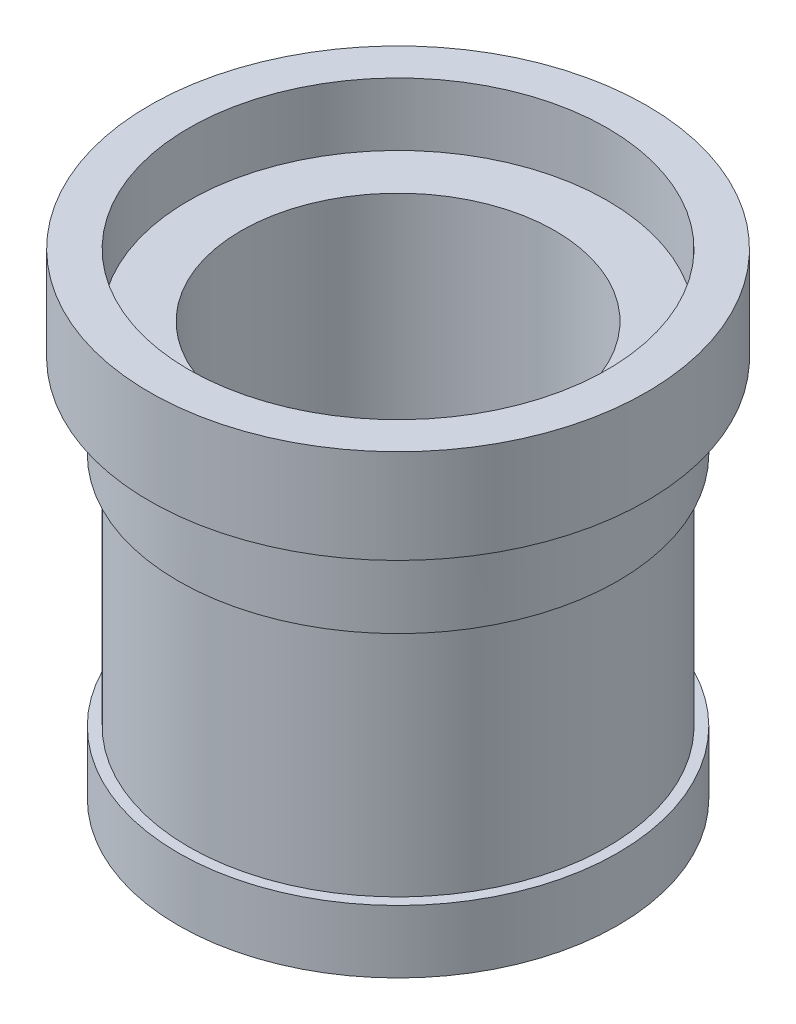
ISO-10303-21;
HEADER;
FILE_DESCRIPTION(('STEP AP214'),'2;1');
FILE_NAME('part.step','',(''),(''),'','','');
FILE_SCHEMA(('AUTOMOTIVE_DESIGN { 1 0 10303 214 1 1 1 1 }'));
ENDSEC;
DATA;
#1=APPLICATION_CONTEXT('core data for automotive mechanical design processes');
#2=APPLICATION_PROTOCOL_DEFINITION('international standard','automotive_design',2000,#1);
#3=PRODUCT_CONTEXT('',#1,'mechanical');
#4=PRODUCT('Part','Part','',(#3));
#5=PRODUCT_RELATED_PRODUCT_CATEGORY('part','',(#4));
#6=PRODUCT_DEFINITION_FORMATION('','',#4);
#7=PRODUCT_DEFINITION_CONTEXT('part definition',#1,'design');
#8=PRODUCT_DEFINITION('design','',#6,#7);
#9=PRODUCT_DEFINITION_SHAPE('','',#8);
#10=(LENGTH_UNIT() NAMED_UNIT(*) SI_UNIT(.MILLI.,.METRE.));
#11=(NAMED_UNIT(*) PLANE_ANGLE_UNIT() SI_UNIT($,.RADIAN.));
#12=(NAMED_UNIT(*) SI_UNIT($,.STERADIAN.) SOLID_ANGLE_UNIT());
#13=UNCERTAINTY_MEASURE_WITH_UNIT(LENGTH_MEASURE(1.E-05),#10,'distance_accuracy_value','');
#14=(GEOMETRIC_REPRESENTATION_CONTEXT(3) GLOBAL_UNCERTAINTY_ASSIGNED_CONTEXT((#13)) GLOBAL_UNIT_ASSIGNED_CONTEXT((#10,
#11,#12)) REPRESENTATION_CONTEXT('',''));
#15=CARTESIAN_POINT('',(0.,0.,0.));
#16=DIRECTION('',(0.,0.,1.));
#17=DIRECTION('',(1.,0.,0.));
#18=AXIS2_PLACEMENT_3D('',#15,#16,#17);
#19=CARTESIAN_POINT('',(0.,-44.5042695074049,0.));
#20=DIRECTION('',(0.,-1.,0.));
#21=DIRECTION('',(0.,0.,-1.));
#22=AXIS2_PLACEMENT_3D('',#19,#20,#21);
#23=CYLINDRICAL_SURFACE('',#22,42.);
#24=CARTESIAN_POINT('',(0.,29.1442732426485,0.));
#25=DIRECTION('',(0.,-1.,0.));
#26=DIRECTION('',(0.,0.,-1.));
#27=AXIS2_PLACEMENT_3D('',#24,#25,#26);
#28=CIRCLE('',#27,42.);
#29=CARTESIAN_POINT('',(0.,29.1442732426485,-42.));
#30=VERTEX_POINT('',#29);
#31=EDGE_CURVE('E131',#30,#30,#28,.T.);
#32=ORIENTED_EDGE('',*,*,#31,.F.);
#33=EDGE_LOOP('',(#32));
#34=FACE_BOUND('',#33,.T.);
#35=CARTESIAN_POINT('',(0.,35.1442732426485,0.));
#36=DIRECTION('',(0.,-1.,0.));
#37=DIRECTION('',(0.,0.,-1.));
#38=AXIS2_PLACEMENT_3D('',#35,#36,#37);
#39=CIRCLE('',#38,42.);
#40=CARTESIAN_POINT('',(-41.7013189239861,35.1442732426485,-5.));
#41=VERTEX_POINT('',#40);
#42=CARTESIAN_POINT('',(-41.7013189239861,35.1442732426485,5.));
#43=VERTEX_POINT('',#42);
#44=EDGE_CURVE('E48',#41,#43,#39,.F.);
#45=ORIENTED_EDGE('',*,*,#44,.F.);
#46=DIRECTION('',(0.,-1.,0.));
#47=VECTOR('',#46,1.);
#48=CARTESIAN_POINT('',(-41.7013189239861,-44.5042695074049,-5.));
#49=LINE('',#48,#47);
#50=CARTESIAN_POINT('',(-41.7013189239861,45.1442732426485,-5.));
#51=VERTEX_POINT('',#50);
#52=EDGE_CURVE('E11',#41,#51,#49,.F.);
#53=ORIENTED_EDGE('',*,*,#52,.T.);
#54=CARTESIAN_POINT('',(0.,45.1442732426485,0.));
#55=DIRECTION('',(0.,-1.,0.));
#56=DIRECTION('',(0.,0.,-1.));
#57=AXIS2_PLACEMENT_3D('',#54,#55,#56);
#58=CIRCLE('',#57,42.);
#59=CARTESIAN_POINT('',(-41.7013189239861,45.1442732426485,5.));
#60=VERTEX_POINT('',#59);
#61=EDGE_CURVE('E135',#51,#60,#58,.T.);
#62=ORIENTED_EDGE('',*,*,#61,.T.);
#63=DIRECTION('',(0.,-1.,0.));
#64=VECTOR('',#63,1.);
#65=CARTESIAN_POINT('',(-41.7013189239861,-44.5042695074049,5.));
#66=LINE('',#65,#64);
#67=EDGE_CURVE('E163',#43,#60,#66,.F.);
#68=ORIENTED_EDGE('',*,*,#67,.F.);
#69=EDGE_LOOP('',(#45,#53,#62,#68));
#70=FACE_BOUND('',#69,.T.);
#71=ADVANCED_FACE('F39',(#34,#70),#23,.T.);
#72=CARTESIAN_POINT('',(42.,-27.8557267573515,0.));
#73=DIRECTION('',(0.,-1.,0.));
#74=DIRECTION('',(0.,0.,-1.));
#75=AXIS2_PLACEMENT_3D('',#72,#73,#74);
#76=PLANE('',#75);
#77=CARTESIAN_POINT('',(0.,-27.8557267573515,0.));
#78=DIRECTION('',(0.,-1.,0.));
#79=DIRECTION('',(0.,0.,-1.));
#80=AXIS2_PLACEMENT_3D('',#77,#78,#79);
#81=CIRCLE('',#80,42.);
#82=CARTESIAN_POINT('',(0.,-27.8557267573515,-42.));
#83=VERTEX_POINT('',#82);
#84=EDGE_CURVE('E114',#83,#83,#81,.T.);
#85=ORIENTED_EDGE('',*,*,#84,.T.);
#86=EDGE_LOOP('',(#85));
#87=FACE_BOUND('',#86,.T.);
#88=CARTESIAN_POINT('',(0.,-27.8557267573515,0.));
#89=DIRECTION('',(0.,-1.,0.));
#90=DIRECTION('',(0.,0.,-1.));
#91=AXIS2_PLACEMENT_3D('',#88,#89,#90);
#92=CIRCLE('',#91,30.);
#93=CARTESIAN_POINT('',(0.,-27.8557267573515,-30.));
#94=VERTEX_POINT('',#93);
#95=EDGE_CURVE('E159',#94,#94,#92,.T.);
#96=ORIENTED_EDGE('',*,*,#95,.F.);
#97=EDGE_LOOP('',(#96));
#98=FACE_BOUND('',#97,.T.);
#99=ADVANCED_FACE('F41',(#87,#98),#76,.T.);
#100=CARTESIAN_POINT('',(0.,-44.5042695074049,0.));
#101=DIRECTION('',(0.,-1.,0.));
#102=DIRECTION('',(0.,0.,-1.));
#103=AXIS2_PLACEMENT_3D('',#100,#101,#102);
#104=CYLINDRICAL_SURFACE('',#103,30.);
#105=ORIENTED_EDGE('',*,*,#95,.T.);
#106=EDGE_LOOP('',(#105));
#107=FACE_BOUND('',#106,.T.);
#108=CARTESIAN_POINT('',(0.,51.1442732426485,0.));
#109=DIRECTION('',(0.,-1.,0.));
#110=DIRECTION('',(0.,0.,-1.));
#111=AXIS2_PLACEMENT_3D('',#108,#109,#110);
#112=CIRCLE('',#111,30.);
#113=CARTESIAN_POINT('',(0.,51.1442732426485,-30.));
#114=VERTEX_POINT('',#113);
#115=EDGE_CURVE('E155',#114,#114,#112,.T.);
#116=ORIENTED_EDGE('',*,*,#115,.F.);
#117=EDGE_LOOP('',(#116));
#118=FACE_BOUND('',#117,.T.);
#119=ADVANCED_FACE('F194',(#107,#118),#104,.F.);
#120=CARTESIAN_POINT('',(40.,51.1442732426485,0.));
#121=DIRECTION('',(0.,1.,0.));
#122=DIRECTION('',(0.,0.,1.));
#123=AXIS2_PLACEMENT_3D('',#120,#121,#122);
#124=PLANE('',#123);
#125=ORIENTED_EDGE('',*,*,#115,.T.);
#126=EDGE_LOOP('',(#125));
#127=FACE_BOUND('',#126,.T.);
#128=CARTESIAN_POINT('',(0.,51.1442732426485,0.));
#129=DIRECTION('',(0.,-1.,0.));
#130=DIRECTION('',(0.,0.,-1.));
#131=AXIS2_PLACEMENT_3D('',#128,#129,#130);
#132=CIRCLE('',#131,40.);
#133=CARTESIAN_POINT('',(0.,51.1442732426485,-40.));
#134=VERTEX_POINT('',#133);
#135=EDGE_CURVE('E151',#134,#134,#132,.T.);
#136=ORIENTED_EDGE('',*,*,#135,.F.);
#137=EDGE_LOOP('',(#136));
#138=FACE_BOUND('',#137,.T.);
#139=ADVANCED_FACE('F291',(#127,#138),#124,.T.);
#140=CARTESIAN_POINT('',(0.,-44.5042695074049,0.));
#141=DIRECTION('',(0.,-1.,0.));
#142=DIRECTION('',(0.,0.,-1.));
#143=AXIS2_PLACEMENT_3D('',#140,#141,#142);
#144=CYLINDRICAL_SURFACE('',#143,40.);
#145=ORIENTED_EDGE('',*,*,#135,.T.);
#146=EDGE_LOOP('',(#145));
#147=FACE_BOUND('',#146,.T.);
#148=CARTESIAN_POINT('',(0.,63.1442732426485,0.));
#149=DIRECTION('',(0.,-1.,0.));
#150=DIRECTION('',(0.,0.,-1.));
#151=AXIS2_PLACEMENT_3D('',#148,#149,#150);
#152=CIRCLE('',#151,40.);
#153=CARTESIAN_POINT('',(0.,63.1442732426485,-40.));
#154=VERTEX_POINT('',#153);
#155=EDGE_CURVE('E147',#154,#154,#152,.T.);
#156=ORIENTED_EDGE('',*,*,#155,.F.);
#157=EDGE_LOOP('',(#156));
#158=FACE_BOUND('',#157,.T.);
#159=ADVANCED_FACE('F185',(#147,#158),#144,.F.);
#160=CARTESIAN_POINT('',(40.,63.1442732426485,0.));
#161=DIRECTION('',(0.,1.,0.));
#162=DIRECTION('',(0.,0.,1.));
#163=AXIS2_PLACEMENT_3D('',#160,#161,#162);
#164=PLANE('',#163);
#165=ORIENTED_EDGE('',*,*,#155,.T.);
#166=EDGE_LOOP('',(#165));
#167=FACE_BOUND('',#166,.T.);
#168=CARTESIAN_POINT('',(0.,63.1442732426485,0.));
#169=DIRECTION('',(0.,-1.,0.));
#170=DIRECTION('',(0.,0.,-1.));
#171=AXIS2_PLACEMENT_3D('',#168,#169,#170);
#172=CIRCLE('',#171,47.5);
#173=CARTESIAN_POINT('',(0.,63.1442732426485,-47.5));
#174=VERTEX_POINT('',#173);
#175=EDGE_CURVE('E143',#174,#174,#172,.T.);
#176=ORIENTED_EDGE('',*,*,#175,.F.);
#177=EDGE_LOOP('',(#176));
#178=FACE_BOUND('',#177,.T.);
#179=ADVANCED_FACE('F179',(#167,#178),#164,.T.);
#180=CARTESIAN_POINT('',(0.,-44.5042695074049,0.));
#181=DIRECTION('',(0.,-1.,0.));
#182=DIRECTION('',(0.,0.,-1.));
#183=AXIS2_PLACEMENT_3D('',#180,#181,#182);
#184=CYLINDRICAL_SURFACE('',#183,47.5);
#185=ORIENTED_EDGE('',*,*,#175,.T.);
#186=EDGE_LOOP('',(#185));
#187=FACE_BOUND('',#186,.T.);
#188=CARTESIAN_POINT('',(0.,45.1442732426485,0.));
#189=DIRECTION('',(0.,-1.,0.));
#190=DIRECTION('',(0.,0.,-1.));
#191=AXIS2_PLACEMENT_3D('',#188,#189,#190);
#192=CIRCLE('',#191,47.5);
#193=CARTESIAN_POINT('',(0.,45.1442732426485,-47.5));
#194=VERTEX_POINT('',#193);
#195=EDGE_CURVE('E139',#194,#194,#192,.T.);
#196=ORIENTED_EDGE('',*,*,#195,.F.);
#197=EDGE_LOOP('',(#196));
#198=FACE_BOUND('',#197,.T.);
#199=ADVANCED_FACE('F174',(#187,#198),#184,.T.);
#200=CARTESIAN_POINT('',(42.,45.1442732426485,0.));
#201=DIRECTION('',(0.,-1.,0.));
#202=DIRECTION('',(0.,0.,-1.));
#203=AXIS2_PLACEMENT_3D('',#200,#201,#202);
#204=PLANE('',#203);
#205=ORIENTED_EDGE('',*,*,#61,.F.);
#206=DIRECTION('',(-1.,0.,0.));
#207=VECTOR('',#206,1.);
#208=CARTESIAN_POINT('',(-42.,45.1442732426485,-5.));
#209=LINE('',#208,#207);
#210=CARTESIAN_POINT('',(-39.,45.1442732426485,-5.));
#211=VERTEX_POINT('',#210);
#212=EDGE_CURVE('E97',#211,#51,#209,.T.);
#213=ORIENTED_EDGE('',*,*,#212,.F.);
#214=DIRECTION('',(0.,0.,1.));
#215=VECTOR('',#214,1.);
#216=CARTESIAN_POINT('',(-39.,45.1442732426485,-5.));
#217=LINE('',#216,#215);
#218=CARTESIAN_POINT('',(-39.,45.1442732426485,5.));
#219=VERTEX_POINT('',#218);
#220=EDGE_CURVE('E96',#211,#219,#217,.T.);
#221=ORIENTED_EDGE('',*,*,#220,.T.);
#222=DIRECTION('',(-1.,0.,0.));
#223=VECTOR('',#222,1.);
#224=CARTESIAN_POINT('',(-42.,45.1442732426485,5.));
#225=LINE('',#224,#223);
#226=EDGE_CURVE('E88',#219,#60,#225,.T.);
#227=ORIENTED_EDGE('',*,*,#226,.T.);
#228=EDGE_LOOP('',(#205,#213,#221,#227));
#229=FACE_BOUND('',#228,.T.);
#230=ORIENTED_EDGE('',*,*,#195,.T.);
#231=EDGE_LOOP('',(#230));
#232=FACE_BOUND('',#231,.T.);
#233=ADVANCED_FACE('F170',(#229,#232),#204,.T.);
#234=CARTESIAN_POINT('',(40.,29.1442732426485,0.));
#235=DIRECTION('',(0.,-1.,0.));
#236=DIRECTION('',(0.,0.,-1.));
#237=AXIS2_PLACEMENT_3D('',#234,#235,#236);
#238=PLANE('',#237);
#239=ORIENTED_EDGE('',*,*,#31,.T.);
#240=EDGE_LOOP('',(#239));
#241=FACE_BOUND('',#240,.T.);
#242=CARTESIAN_POINT('',(0.,29.1442732426485,0.));
#243=DIRECTION('',(0.,-1.,0.));
#244=DIRECTION('',(0.,0.,-1.));
#245=AXIS2_PLACEMENT_3D('',#242,#243,#244);
#246=CIRCLE('',#245,40.);
#247=CARTESIAN_POINT('',(0.,29.1442732426485,-40.));
#248=VERTEX_POINT('',#247);
#249=EDGE_CURVE('E127',#248,#248,#246,.T.);
#250=ORIENTED_EDGE('',*,*,#249,.F.);
#251=EDGE_LOOP('',(#250));
#252=FACE_BOUND('',#251,.T.);
#253=ADVANCED_FACE('F173',(#241,#252),#238,.T.);
#254=CARTESIAN_POINT('',(0.,-44.5042695074049,0.));
#255=DIRECTION('',(0.,-1.,0.));
#256=DIRECTION('',(0.,0.,-1.));
#257=AXIS2_PLACEMENT_3D('',#254,#255,#256);
#258=CYLINDRICAL_SURFACE('',#257,40.);
#259=ORIENTED_EDGE('',*,*,#249,.T.);
#260=EDGE_LOOP('',(#259));
#261=FACE_BOUND('',#260,.T.);
#262=CARTESIAN_POINT('',(0.,-15.8557267573515,0.));
#263=DIRECTION('',(0.,-1.,0.));
#264=DIRECTION('',(0.,0.,-1.));
#265=AXIS2_PLACEMENT_3D('',#262,#263,#264);
#266=CIRCLE('',#265,40.);
#267=CARTESIAN_POINT('',(0.,-15.8557267573515,-40.));
#268=VERTEX_POINT('',#267);
#269=EDGE_CURVE('E123',#268,#268,#266,.T.);
#270=ORIENTED_EDGE('',*,*,#269,.F.);
#271=EDGE_LOOP('',(#270));
#272=FACE_BOUND('',#271,.T.);
#273=ADVANCED_FACE('F200',(#261,#272),#258,.T.);
#274=CARTESIAN_POINT('',(42.,-15.8557267573515,0.));
#275=DIRECTION('',(0.,1.,0.));
#276=DIRECTION('',(0.,0.,1.));
#277=AXIS2_PLACEMENT_3D('',#274,#275,#276);
#278=PLANE('',#277);
#279=ORIENTED_EDGE('',*,*,#269,.T.);
#280=EDGE_LOOP('',(#279));
#281=FACE_BOUND('',#280,.T.);
#282=CARTESIAN_POINT('',(0.,-15.8557267573515,0.));
#283=DIRECTION('',(0.,-1.,0.));
#284=DIRECTION('',(0.,0.,-1.));
#285=AXIS2_PLACEMENT_3D('',#282,#283,#284);
#286=CIRCLE('',#285,42.);
#287=CARTESIAN_POINT('',(0.,-15.8557267573515,-42.));
#288=VERTEX_POINT('',#287);
#289=EDGE_CURVE('E119',#288,#288,#286,.T.);
#290=ORIENTED_EDGE('',*,*,#289,.F.);
#291=EDGE_LOOP('',(#290));
#292=FACE_BOUND('',#291,.T.);
#293=ADVANCED_FACE('F204',(#281,#292),#278,.T.);
#294=CARTESIAN_POINT('',(0.,-44.5042695074049,0.));
#295=DIRECTION('',(0.,-1.,0.));
#296=DIRECTION('',(0.,0.,-1.));
#297=AXIS2_PLACEMENT_3D('',#294,#295,#296);
#298=CYLINDRICAL_SURFACE('',#297,42.);
#299=ORIENTED_EDGE('',*,*,#289,.T.);
#300=EDGE_LOOP('',(#299));
#301=FACE_BOUND('',#300,.T.);
#302=ORIENTED_EDGE('',*,*,#84,.F.);
#303=EDGE_LOOP('',(#302));
#304=FACE_BOUND('',#303,.T.);
#305=ADVANCED_FACE('F208',(#301,#304),#298,.T.);
#306=CARTESIAN_POINT('',(-39.,45.1442732426485,-5.));
#307=DIRECTION('',(1.,0.,0.));
#308=DIRECTION('',(0.,0.,-1.));
#309=AXIS2_PLACEMENT_3D('',#306,#307,#308);
#310=PLANE('',#309);
#311=DIRECTION('',(0.,1.,0.));
#312=VECTOR('',#311,1.);
#313=CARTESIAN_POINT('',(-39.,45.1442732426485,5.));
#314=LINE('',#313,#312);
#315=CARTESIAN_POINT('',(-39.,35.1442732426485,5.));
#316=VERTEX_POINT('',#315);
#317=EDGE_CURVE('E107',#316,#219,#314,.T.);
#318=ORIENTED_EDGE('',*,*,#317,.T.);
#319=ORIENTED_EDGE('',*,*,#220,.F.);
#320=DIRECTION('',(0.,1.,0.));
#321=VECTOR('',#320,1.);
#322=CARTESIAN_POINT('',(-39.,45.1442732426485,-5.));
#323=LINE('',#322,#321);
#324=CARTESIAN_POINT('',(-39.,35.1442732426485,-5.));
#325=VERTEX_POINT('',#324);
#326=EDGE_CURVE('E84',#325,#211,#323,.T.);
#327=ORIENTED_EDGE('',*,*,#326,.F.);
#328=DIRECTION('',(0.,0.,1.));
#329=VECTOR('',#328,1.);
#330=CARTESIAN_POINT('',(-39.,35.1442732426485,-5.));
#331=LINE('',#330,#329);
#332=EDGE_CURVE('E91',#325,#316,#331,.T.);
#333=ORIENTED_EDGE('',*,*,#332,.T.);
#334=EDGE_LOOP('',(#318,#319,#327,#333));
#335=FACE_BOUND('',#334,.T.);
#336=ADVANCED_FACE('F99',(#335),#310,.F.);
#337=CARTESIAN_POINT('',(-42.,35.1442732426485,-5.));
#338=DIRECTION('',(0.,-1.,0.));
#339=DIRECTION('',(0.,0.,-1.));
#340=AXIS2_PLACEMENT_3D('',#337,#338,#339);
#341=PLANE('',#340);
#342=DIRECTION('',(1.,0.,0.));
#343=VECTOR('',#342,1.);
#344=CARTESIAN_POINT('',(-42.,35.1442732426485,-5.));
#345=LINE('',#344,#343);
#346=EDGE_CURVE('E80',#41,#325,#345,.T.);
#347=ORIENTED_EDGE('',*,*,#346,.F.);
#348=ORIENTED_EDGE('',*,*,#44,.T.);
#349=DIRECTION('',(1.,0.,0.));
#350=VECTOR('',#349,1.);
#351=CARTESIAN_POINT('',(-42.,35.1442732426485,5.));
#352=LINE('',#351,#350);
#353=EDGE_CURVE('E55',#43,#316,#352,.T.);
#354=ORIENTED_EDGE('',*,*,#353,.T.);
#355=ORIENTED_EDGE('',*,*,#332,.F.);
#356=EDGE_LOOP('',(#347,#348,#354,#355));
#357=FACE_BOUND('',#356,.T.);
#358=ADVANCED_FACE('F92',(#357),#341,.F.);
#359=CARTESIAN_POINT('',(0.,0.,-5.));
#360=DIRECTION('',(0.,0.,1.));
#361=DIRECTION('',(1.,0.,0.));
#362=AXIS2_PLACEMENT_3D('',#359,#360,#361);
#363=PLANE('',#362);
#364=ORIENTED_EDGE('',*,*,#346,.T.);
#365=ORIENTED_EDGE('',*,*,#326,.T.);
#366=ORIENTED_EDGE('',*,*,#212,.T.);
#367=ORIENTED_EDGE('',*,*,#52,.F.);
#368=EDGE_LOOP('',(#364,#365,#366,#367));
#369=FACE_BOUND('',#368,.T.);
#370=ADVANCED_FACE('F82',(#369),#363,.T.);
#371=CARTESIAN_POINT('',(0.,0.,5.));
#372=DIRECTION('',(0.,0.,1.));
#373=DIRECTION('',(1.,0.,0.));
#374=AXIS2_PLACEMENT_3D('',#371,#372,#373);
#375=PLANE('',#374);
#376=ORIENTED_EDGE('',*,*,#67,.T.);
#377=ORIENTED_EDGE('',*,*,#226,.F.);
#378=ORIENTED_EDGE('',*,*,#317,.F.);
#379=ORIENTED_EDGE('',*,*,#353,.F.);
#380=EDGE_LOOP('',(#376,#377,#378,#379));
#381=FACE_BOUND('',#380,.T.);
#382=ADVANCED_FACE('F168',(#381),#375,.F.);
#383=CLOSED_SHELL('',(#71,#99,#119,#139,#159,#179,#199,#233,#253,#273,#293,#305,#336,#358,#370,#382));
#384=MANIFOLD_SOLID_BREP('B2',#383);
#385=ADVANCED_BREP_SHAPE_REPRESENTATION('',(#18,#384),#14);
#386=SHAPE_DEFINITION_REPRESENTATION(#9,#385);
ENDSEC;
END-ISO-10303-21;
